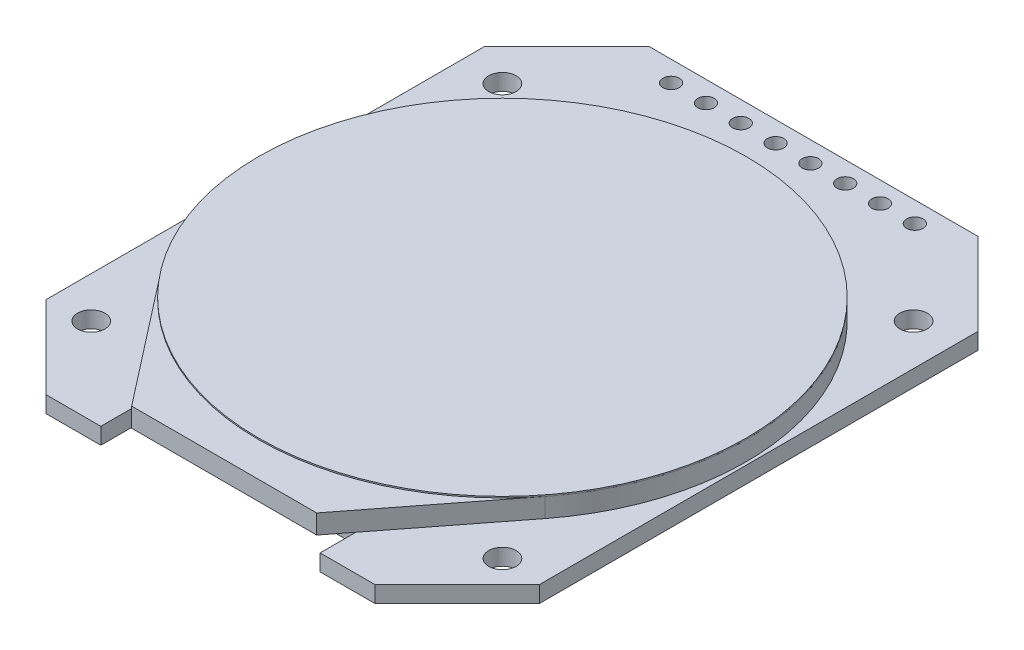
ISO-10303-21;
HEADER;
FILE_DESCRIPTION(('STEP AP214'),'2;1');
FILE_NAME('part.step','',(''),(''),'','','');
FILE_SCHEMA(('AUTOMOTIVE_DESIGN { 1 0 10303 214 1 1 1 1 }'));
ENDSEC;
DATA;
#1=APPLICATION_CONTEXT('core data for automotive mechanical design processes');
#2=APPLICATION_PROTOCOL_DEFINITION('international standard','automotive_design',2000,#1);
#3=PRODUCT_CONTEXT('',#1,'mechanical');
#4=PRODUCT('Part','Part','',(#3));
#5=PRODUCT_RELATED_PRODUCT_CATEGORY('part','',(#4));
#6=PRODUCT_DEFINITION_FORMATION('','',#4);
#7=PRODUCT_DEFINITION_CONTEXT('part definition',#1,'design');
#8=PRODUCT_DEFINITION('design','',#6,#7);
#9=PRODUCT_DEFINITION_SHAPE('','',#8);
#10=(LENGTH_UNIT() NAMED_UNIT(*) SI_UNIT(.MILLI.,.METRE.));
#11=(NAMED_UNIT(*) PLANE_ANGLE_UNIT() SI_UNIT($,.RADIAN.));
#12=(NAMED_UNIT(*) SI_UNIT($,.STERADIAN.) SOLID_ANGLE_UNIT());
#13=UNCERTAINTY_MEASURE_WITH_UNIT(LENGTH_MEASURE(1.E-05),#10,'distance_accuracy_value','');
#14=(GEOMETRIC_REPRESENTATION_CONTEXT(3) GLOBAL_UNCERTAINTY_ASSIGNED_CONTEXT((#13)) GLOBAL_UNIT_ASSIGNED_CONTEXT((#10,
#11,#12)) REPRESENTATION_CONTEXT('',''));
#15=CARTESIAN_POINT('',(0.,0.,0.));
#16=DIRECTION('',(0.,0.,1.));
#17=DIRECTION('',(1.,0.,0.));
#18=AXIS2_PLACEMENT_3D('',#15,#16,#17);
#19=CARTESIAN_POINT('',(0.,1.5,0.699999999999999));
#20=DIRECTION('',(0.,-1.,0.));
#21=DIRECTION('',(0.,0.,-1.));
#22=AXIS2_PLACEMENT_3D('',#19,#20,#21);
#23=CYLINDRICAL_SURFACE('',#22,17.79);
#24=CARTESIAN_POINT('',(0.,1.5,0.699999999999999));
#25=DIRECTION('',(0.,1.,0.));
#26=DIRECTION('',(0.,0.,1.));
#27=AXIS2_PLACEMENT_3D('',#24,#25,#26);
#28=CIRCLE('',#27,17.79);
#29=CARTESIAN_POINT('',(0.,1.5,18.49));
#30=VERTEX_POINT('',#29);
#31=EDGE_CURVE('E11',#30,#30,#28,.T.);
#32=ORIENTED_EDGE('',*,*,#31,.F.);
#33=EDGE_LOOP('',(#32));
#34=FACE_BOUND('',#33,.T.);
#35=CARTESIAN_POINT('',(0.,1.4,0.699999999999999));
#36=DIRECTION('',(0.,1.,0.));
#37=DIRECTION('',(0.,0.,1.));
#38=AXIS2_PLACEMENT_3D('',#35,#36,#37);
#39=CIRCLE('',#38,17.79);
#40=CARTESIAN_POINT('',(0.,1.4,18.49));
#41=VERTEX_POINT('',#40);
#42=EDGE_CURVE('E52',#41,#41,#39,.T.);
#43=ORIENTED_EDGE('',*,*,#42,.T.);
#44=EDGE_LOOP('',(#43));
#45=FACE_BOUND('',#44,.T.);
#46=ADVANCED_FACE('F49',(#34,#45),#23,.T.);
#47=CARTESIAN_POINT('',(0.,1.5,0.699999999999999));
#48=DIRECTION('',(0.,1.,0.));
#49=DIRECTION('',(0.,0.,1.));
#50=AXIS2_PLACEMENT_3D('',#47,#48,#49);
#51=PLANE('',#50);
#52=ORIENTED_EDGE('',*,*,#31,.T.);
#53=EDGE_LOOP('',(#52));
#54=FACE_BOUND('',#53,.T.);
#55=ADVANCED_FACE('F64',(#54),#51,.T.);
#56=CARTESIAN_POINT('',(0.,1.4,0.699999999999999));
#57=DIRECTION('',(0.,1.,0.));
#58=DIRECTION('',(0.,0.,1.));
#59=AXIS2_PLACEMENT_3D('',#56,#57,#58);
#60=PLANE('',#59);
#61=ORIENTED_EDGE('',*,*,#42,.F.);
#62=EDGE_LOOP('',(#61));
#63=FACE_BOUND('',#62,.T.);
#64=ADVANCED_FACE('F62',(#63),#60,.F.);
#65=CLOSED_SHELL('',(#46,#55,#64));
#66=MANIFOLD_SOLID_BREP('B2',#65);
#67=CARTESIAN_POINT('',(14.3828217753482,1.4,11.1844594671487));
#68=DIRECTION('',(-0.789410190203827,0.,-0.613866069759811));
#69=DIRECTION('',(-0.613866069759811,0.,0.789410190203827));
#70=AXIS2_PLACEMENT_3D('',#67,#68,#69);
#71=PLANE('',#70);
#72=DIRECTION('',(0.613866069759811,0.,-0.789410190203827));
#73=VECTOR('',#72,1.);
#74=CARTESIAN_POINT('',(14.3828217753482,0.,11.1844594671487));
#75=LINE('',#74,#73);
#76=CARTESIAN_POINT('',(6.75,0.,21.));
#77=VERTEX_POINT('',#76);
#78=CARTESIAN_POINT('',(14.0436072837261,0.,11.620677381027));
#79=VERTEX_POINT('',#78);
#80=EDGE_CURVE('E161',#77,#79,#75,.T.);
#81=ORIENTED_EDGE('',*,*,#80,.T.);
#82=DIRECTION('',(0.,-1.,0.));
#83=VECTOR('',#82,1.);
#84=CARTESIAN_POINT('',(14.0436072837261,1.4,11.620677381027));
#85=LINE('',#84,#83);
#86=CARTESIAN_POINT('',(14.0436072837261,1.4,11.620677381027));
#87=VERTEX_POINT('',#86);
#88=EDGE_CURVE('E47',#87,#79,#85,.T.);
#89=ORIENTED_EDGE('',*,*,#88,.F.);
#90=DIRECTION('',(0.613866069759811,0.,-0.789410190203827));
#91=VECTOR('',#90,1.);
#92=CARTESIAN_POINT('',(14.3828217753482,1.4,11.1844594671487));
#93=LINE('',#92,#91);
#94=CARTESIAN_POINT('',(6.75,1.4,21.));
#95=VERTEX_POINT('',#94);
#96=EDGE_CURVE('E149',#95,#87,#93,.T.);
#97=ORIENTED_EDGE('',*,*,#96,.F.);
#98=DIRECTION('',(0.,-1.,0.));
#99=VECTOR('',#98,1.);
#100=CARTESIAN_POINT('',(6.75,1.4,21.));
#101=LINE('',#100,#99);
#102=EDGE_CURVE('E157',#95,#77,#101,.T.);
#103=ORIENTED_EDGE('',*,*,#102,.T.);
#104=EDGE_LOOP('',(#81,#89,#97,#103));
#105=FACE_BOUND('',#104,.T.);
#106=ADVANCED_FACE('F98',(#105),#71,.F.);
#107=CARTESIAN_POINT('',(0.,1.4,0.699999999999999));
#108=DIRECTION('',(0.,-1.,0.));
#109=DIRECTION('',(0.,0.,-1.));
#110=AXIS2_PLACEMENT_3D('',#107,#108,#109);
#111=CYLINDRICAL_SURFACE('',#110,17.79);
#112=CARTESIAN_POINT('',(0.,0.,0.699999999999999));
#113=DIRECTION('',(0.,1.,0.));
#114=DIRECTION('',(0.,0.,1.));
#115=AXIS2_PLACEMENT_3D('',#112,#113,#114);
#116=CIRCLE('',#115,17.79);
#117=CARTESIAN_POINT('',(-14.0436072837261,0.,11.620677381027));
#118=VERTEX_POINT('',#117);
#119=EDGE_CURVE('E153',#79,#118,#116,.T.);
#120=ORIENTED_EDGE('',*,*,#119,.T.);
#121=DIRECTION('',(0.,-1.,0.));
#122=VECTOR('',#121,1.);
#123=CARTESIAN_POINT('',(-14.0436072837261,1.4,11.620677381027));
#124=LINE('',#123,#122);
#125=CARTESIAN_POINT('',(-14.0436072837261,1.4,11.620677381027));
#126=VERTEX_POINT('',#125);
#127=EDGE_CURVE('E106',#126,#118,#124,.T.);
#128=ORIENTED_EDGE('',*,*,#127,.F.);
#129=CARTESIAN_POINT('',(0.,1.4,0.699999999999999));
#130=DIRECTION('',(0.,1.,0.));
#131=DIRECTION('',(0.,0.,1.));
#132=AXIS2_PLACEMENT_3D('',#129,#130,#131);
#133=CIRCLE('',#132,17.79);
#134=EDGE_CURVE('E144',#87,#126,#133,.T.);
#135=ORIENTED_EDGE('',*,*,#134,.F.);
#136=ORIENTED_EDGE('',*,*,#88,.T.);
#137=EDGE_LOOP('',(#120,#128,#135,#136));
#138=FACE_BOUND('',#137,.T.);
#139=ADVANCED_FACE('F152',(#138),#111,.T.);
#140=CARTESIAN_POINT('',(-14.3828217753482,1.4,11.1844594671487));
#141=DIRECTION('',(0.789410190203827,0.,-0.613866069759811));
#142=DIRECTION('',(-0.613866069759811,0.,-0.789410190203827));
#143=AXIS2_PLACEMENT_3D('',#140,#141,#142);
#144=PLANE('',#143);
#145=DIRECTION('',(0.613866069759811,0.,0.789410190203827));
#146=VECTOR('',#145,1.);
#147=CARTESIAN_POINT('',(-14.3828217753482,0.,11.1844594671487));
#148=LINE('',#147,#146);
#149=CARTESIAN_POINT('',(-6.75,0.,21.));
#150=VERTEX_POINT('',#149);
#151=EDGE_CURVE('E131',#118,#150,#148,.T.);
#152=ORIENTED_EDGE('',*,*,#151,.T.);
#153=DIRECTION('',(0.,-1.,0.));
#154=VECTOR('',#153,1.);
#155=CARTESIAN_POINT('',(-6.75,1.4,21.));
#156=LINE('',#155,#154);
#157=CARTESIAN_POINT('',(-6.75,1.4,21.));
#158=VERTEX_POINT('',#157);
#159=EDGE_CURVE('E154',#158,#150,#156,.T.);
#160=ORIENTED_EDGE('',*,*,#159,.F.);
#161=DIRECTION('',(0.613866069759811,0.,0.789410190203827));
#162=VECTOR('',#161,1.);
#163=CARTESIAN_POINT('',(-14.3828217753482,1.4,11.1844594671487));
#164=LINE('',#163,#162);
#165=EDGE_CURVE('E147',#126,#158,#164,.T.);
#166=ORIENTED_EDGE('',*,*,#165,.F.);
#167=ORIENTED_EDGE('',*,*,#127,.T.);
#168=EDGE_LOOP('',(#152,#160,#166,#167));
#169=FACE_BOUND('',#168,.T.);
#170=ADVANCED_FACE('F155',(#169),#144,.F.);
#171=CARTESIAN_POINT('',(0.,1.4,21.));
#172=DIRECTION('',(0.,0.,-1.));
#173=DIRECTION('',(-1.,0.,0.));
#174=AXIS2_PLACEMENT_3D('',#171,#172,#173);
#175=PLANE('',#174);
#176=DIRECTION('',(1.,0.,0.));
#177=VECTOR('',#176,1.);
#178=CARTESIAN_POINT('',(0.,0.,21.));
#179=LINE('',#178,#177);
#180=EDGE_CURVE('E137',#150,#77,#179,.T.);
#181=ORIENTED_EDGE('',*,*,#180,.T.);
#182=ORIENTED_EDGE('',*,*,#102,.F.);
#183=DIRECTION('',(1.,0.,0.));
#184=VECTOR('',#183,1.);
#185=CARTESIAN_POINT('',(0.,1.4,21.));
#186=LINE('',#185,#184);
#187=EDGE_CURVE('E114',#158,#95,#186,.T.);
#188=ORIENTED_EDGE('',*,*,#187,.F.);
#189=ORIENTED_EDGE('',*,*,#159,.T.);
#190=EDGE_LOOP('',(#181,#182,#188,#189));
#191=FACE_BOUND('',#190,.T.);
#192=ADVANCED_FACE('F168',(#191),#175,.F.);
#193=CARTESIAN_POINT('',(0.,1.4,0.));
#194=DIRECTION('',(0.,1.,0.));
#195=DIRECTION('',(0.,0.,1.));
#196=AXIS2_PLACEMENT_3D('',#193,#194,#195);
#197=PLANE('',#196);
#198=ORIENTED_EDGE('',*,*,#96,.T.);
#199=ORIENTED_EDGE('',*,*,#134,.T.);
#200=ORIENTED_EDGE('',*,*,#165,.T.);
#201=ORIENTED_EDGE('',*,*,#187,.T.);
#202=EDGE_LOOP('',(#198,#199,#200,#201));
#203=FACE_BOUND('',#202,.T.);
#204=ADVANCED_FACE('F145',(#203),#197,.T.);
#205=CARTESIAN_POINT('',(0.,0.,0.));
#206=DIRECTION('',(0.,1.,0.));
#207=DIRECTION('',(0.,0.,1.));
#208=AXIS2_PLACEMENT_3D('',#205,#206,#207);
#209=PLANE('',#208);
#210=ORIENTED_EDGE('',*,*,#80,.F.);
#211=ORIENTED_EDGE('',*,*,#180,.F.);
#212=ORIENTED_EDGE('',*,*,#151,.F.);
#213=ORIENTED_EDGE('',*,*,#119,.F.);
#214=EDGE_LOOP('',(#210,#211,#212,#213));
#215=FACE_BOUND('',#214,.T.);
#216=ADVANCED_FACE('F171',(#215),#209,.F.);
#217=CLOSED_SHELL('',(#106,#139,#170,#192,#204,#216));
#218=MANIFOLD_SOLID_BREP('B6',#217);
#219=CARTESIAN_POINT('',(0.,-1.2,19.));
#220=DIRECTION('',(0.,0.,1.));
#221=DIRECTION('',(1.,0.,0.));
#222=AXIS2_PLACEMENT_3D('',#219,#220,#221);
#223=PLANE('',#222);
#224=DIRECTION('',(1.,0.,0.));
#225=VECTOR('',#224,1.);
#226=CARTESIAN_POINT('',(0.,0.,19.));
#227=LINE('',#226,#225);
#228=CARTESIAN_POINT('',(-8.,0.,19.));
#229=VERTEX_POINT('',#228);
#230=CARTESIAN_POINT('',(8.,0.,19.));
#231=VERTEX_POINT('',#230);
#232=EDGE_CURVE('E392',#229,#231,#227,.T.);
#233=ORIENTED_EDGE('',*,*,#232,.F.);
#234=DIRECTION('',(0.,1.,0.));
#235=VECTOR('',#234,1.);
#236=CARTESIAN_POINT('',(-8.,-1.2,19.));
#237=LINE('',#236,#235);
#238=CARTESIAN_POINT('',(-8.,-1.2,19.));
#239=VERTEX_POINT('',#238);
#240=EDGE_CURVE('E96',#239,#229,#237,.T.);
#241=ORIENTED_EDGE('',*,*,#240,.F.);
#242=DIRECTION('',(1.,0.,0.));
#243=VECTOR('',#242,1.);
#244=CARTESIAN_POINT('',(0.,-1.2,19.));
#245=LINE('',#244,#243);
#246=CARTESIAN_POINT('',(8.,-1.2,19.));
#247=VERTEX_POINT('',#246);
#248=EDGE_CURVE('E458',#239,#247,#245,.T.);
#249=ORIENTED_EDGE('',*,*,#248,.T.);
#250=DIRECTION('',(0.,1.,0.));
#251=VECTOR('',#250,1.);
#252=CARTESIAN_POINT('',(8.,-1.2,19.));
#253=LINE('',#252,#251);
#254=EDGE_CURVE('E237',#247,#231,#253,.T.);
#255=ORIENTED_EDGE('',*,*,#254,.T.);
#256=EDGE_LOOP('',(#233,#241,#249,#255));
#257=FACE_BOUND('',#256,.T.);
#258=ADVANCED_FACE('F233',(#257),#223,.T.);
#259=CARTESIAN_POINT('',(-8.,-1.2,0.));
#260=DIRECTION('',(1.,0.,0.));
#261=DIRECTION('',(0.,0.,-1.));
#262=AXIS2_PLACEMENT_3D('',#259,#260,#261);
#263=PLANE('',#262);
#264=DIRECTION('',(0.,0.,-1.));
#265=VECTOR('',#264,1.);
#266=CARTESIAN_POINT('',(-8.,0.,0.));
#267=LINE('',#266,#265);
#268=CARTESIAN_POINT('',(-8.,0.,22.));
#269=VERTEX_POINT('',#268);
#270=EDGE_CURVE('E421',#269,#229,#267,.T.);
#271=ORIENTED_EDGE('',*,*,#270,.F.);
#272=DIRECTION('',(0.,1.,0.));
#273=VECTOR('',#272,1.);
#274=CARTESIAN_POINT('',(-8.,-1.2,22.));
#275=LINE('',#274,#273);
#276=CARTESIAN_POINT('',(-8.,-1.2,22.));
#277=VERTEX_POINT('',#276);
#278=EDGE_CURVE('E243',#277,#269,#275,.T.);
#279=ORIENTED_EDGE('',*,*,#278,.F.);
#280=DIRECTION('',(0.,0.,-1.));
#281=VECTOR('',#280,1.);
#282=CARTESIAN_POINT('',(-8.,-1.2,0.));
#283=LINE('',#282,#281);
#284=EDGE_CURVE('E344',#277,#239,#283,.T.);
#285=ORIENTED_EDGE('',*,*,#284,.T.);
#286=ORIENTED_EDGE('',*,*,#240,.T.);
#287=EDGE_LOOP('',(#271,#279,#285,#286));
#288=FACE_BOUND('',#287,.T.);
#289=ADVANCED_FACE('F463',(#288),#263,.T.);
#290=CARTESIAN_POINT('',(0.,-1.2,22.));
#291=DIRECTION('',(0.,0.,1.));
#292=DIRECTION('',(1.,0.,0.));
#293=AXIS2_PLACEMENT_3D('',#290,#291,#292);
#294=PLANE('',#293);
#295=DIRECTION('',(1.,0.,0.));
#296=VECTOR('',#295,1.);
#297=CARTESIAN_POINT('',(0.,0.,22.));
#298=LINE('',#297,#296);
#299=CARTESIAN_POINT('',(-12.,0.,22.));
#300=VERTEX_POINT('',#299);
#301=EDGE_CURVE('E332',#300,#269,#298,.T.);
#302=ORIENTED_EDGE('',*,*,#301,.F.);
#303=DIRECTION('',(0.,1.,0.));
#304=VECTOR('',#303,1.);
#305=CARTESIAN_POINT('',(-12.,-1.2,22.));
#306=LINE('',#305,#304);
#307=CARTESIAN_POINT('',(-12.,-1.2,22.));
#308=VERTEX_POINT('',#307);
#309=EDGE_CURVE('E327',#308,#300,#306,.T.);
#310=ORIENTED_EDGE('',*,*,#309,.F.);
#311=DIRECTION('',(1.,0.,0.));
#312=VECTOR('',#311,1.);
#313=CARTESIAN_POINT('',(0.,-1.2,22.));
#314=LINE('',#313,#312);
#315=EDGE_CURVE('E330',#308,#277,#314,.T.);
#316=ORIENTED_EDGE('',*,*,#315,.T.);
#317=ORIENTED_EDGE('',*,*,#278,.T.);
#318=EDGE_LOOP('',(#302,#310,#316,#317));
#319=FACE_BOUND('',#318,.T.);
#320=ADVANCED_FACE('F329',(#319),#294,.T.);
#321=CARTESIAN_POINT('',(-17.,-1.2,17.));
#322=DIRECTION('',(-0.707106781186547,0.,0.707106781186548));
#323=DIRECTION('',(0.707106781186548,0.,0.707106781186547));
#324=AXIS2_PLACEMENT_3D('',#321,#322,#323);
#325=PLANE('',#324);
#326=DIRECTION('',(0.707106781186548,0.,0.707106781186547));
#327=VECTOR('',#326,1.);
#328=CARTESIAN_POINT('',(-17.,0.,17.));
#329=LINE('',#328,#327);
#330=CARTESIAN_POINT('',(-18.,0.,16.));
#331=VERTEX_POINT('',#330);
#332=EDGE_CURVE('E419',#331,#300,#329,.T.);
#333=ORIENTED_EDGE('',*,*,#332,.F.);
#334=DIRECTION('',(0.,1.,0.));
#335=VECTOR('',#334,1.);
#336=CARTESIAN_POINT('',(-18.,-1.2,16.));
#337=LINE('',#336,#335);
#338=CARTESIAN_POINT('',(-18.,-1.2,16.));
#339=VERTEX_POINT('',#338);
#340=EDGE_CURVE('E337',#339,#331,#337,.T.);
#341=ORIENTED_EDGE('',*,*,#340,.F.);
#342=DIRECTION('',(0.707106781186548,0.,0.707106781186547));
#343=VECTOR('',#342,1.);
#344=CARTESIAN_POINT('',(-17.,-1.2,17.));
#345=LINE('',#344,#343);
#346=EDGE_CURVE('E343',#339,#308,#345,.T.);
#347=ORIENTED_EDGE('',*,*,#346,.T.);
#348=ORIENTED_EDGE('',*,*,#309,.T.);
#349=EDGE_LOOP('',(#333,#341,#347,#348));
#350=FACE_BOUND('',#349,.T.);
#351=ADVANCED_FACE('F347',(#350),#325,.T.);
#352=CARTESIAN_POINT('',(-18.,-1.2,0.));
#353=DIRECTION('',(1.,0.,0.));
#354=DIRECTION('',(0.,0.,-1.));
#355=AXIS2_PLACEMENT_3D('',#352,#353,#354);
#356=PLANE('',#355);
#357=DIRECTION('',(0.,0.,-1.));
#358=VECTOR('',#357,1.);
#359=CARTESIAN_POINT('',(-18.,0.,0.));
#360=LINE('',#359,#358);
#361=CARTESIAN_POINT('',(-18.,0.,-16.));
#362=VERTEX_POINT('',#361);
#363=EDGE_CURVE('E416',#331,#362,#360,.T.);
#364=ORIENTED_EDGE('',*,*,#363,.T.);
#365=DIRECTION('',(0.,1.,0.));
#366=VECTOR('',#365,1.);
#367=CARTESIAN_POINT('',(-18.,-1.2,-16.));
#368=LINE('',#367,#366);
#369=CARTESIAN_POINT('',(-18.,-1.2,-16.));
#370=VERTEX_POINT('',#369);
#371=EDGE_CURVE('E445',#370,#362,#368,.T.);
#372=ORIENTED_EDGE('',*,*,#371,.F.);
#373=DIRECTION('',(0.,0.,-1.));
#374=VECTOR('',#373,1.);
#375=CARTESIAN_POINT('',(-18.,-1.2,0.));
#376=LINE('',#375,#374);
#377=EDGE_CURVE('E349',#339,#370,#376,.T.);
#378=ORIENTED_EDGE('',*,*,#377,.F.);
#379=ORIENTED_EDGE('',*,*,#340,.T.);
#380=EDGE_LOOP('',(#364,#372,#378,#379));
#381=FACE_BOUND('',#380,.T.);
#382=ADVANCED_FACE('F479',(#381),#356,.F.);
#383=CARTESIAN_POINT('',(-17.,-1.2,-17.));
#384=DIRECTION('',(-0.707106781186547,0.,-0.707106781186548));
#385=DIRECTION('',(-0.707106781186548,0.,0.707106781186547));
#386=AXIS2_PLACEMENT_3D('',#383,#384,#385);
#387=PLANE('',#386);
#388=DIRECTION('',(-0.707106781186548,0.,0.707106781186547));
#389=VECTOR('',#388,1.);
#390=CARTESIAN_POINT('',(-17.,0.,-17.));
#391=LINE('',#390,#389);
#392=CARTESIAN_POINT('',(-12.,0.,-22.));
#393=VERTEX_POINT('',#392);
#394=EDGE_CURVE('E413',#393,#362,#391,.T.);
#395=ORIENTED_EDGE('',*,*,#394,.F.);
#396=DIRECTION('',(0.,1.,0.));
#397=VECTOR('',#396,1.);
#398=CARTESIAN_POINT('',(-12.,-1.2,-22.));
#399=LINE('',#398,#397);
#400=CARTESIAN_POINT('',(-12.,-1.2,-22.));
#401=VERTEX_POINT('',#400);
#402=EDGE_CURVE('E447',#401,#393,#399,.T.);
#403=ORIENTED_EDGE('',*,*,#402,.F.);
#404=DIRECTION('',(-0.707106781186548,0.,0.707106781186547));
#405=VECTOR('',#404,1.);
#406=CARTESIAN_POINT('',(-17.,-1.2,-17.));
#407=LINE('',#406,#405);
#408=EDGE_CURVE('E351',#401,#370,#407,.T.);
#409=ORIENTED_EDGE('',*,*,#408,.T.);
#410=ORIENTED_EDGE('',*,*,#371,.T.);
#411=EDGE_LOOP('',(#395,#403,#409,#410));
#412=FACE_BOUND('',#411,.T.);
#413=ADVANCED_FACE('F482',(#412),#387,.T.);
#414=CARTESIAN_POINT('',(0.,-1.2,-22.));
#415=DIRECTION('',(0.,0.,1.));
#416=DIRECTION('',(1.,0.,0.));
#417=AXIS2_PLACEMENT_3D('',#414,#415,#416);
#418=PLANE('',#417);
#419=DIRECTION('',(1.,0.,0.));
#420=VECTOR('',#419,1.);
#421=CARTESIAN_POINT('',(0.,0.,-22.));
#422=LINE('',#421,#420);
#423=CARTESIAN_POINT('',(12.,0.,-22.));
#424=VERTEX_POINT('',#423);
#425=EDGE_CURVE('E410',#393,#424,#422,.T.);
#426=ORIENTED_EDGE('',*,*,#425,.T.);
#427=DIRECTION('',(0.,1.,0.));
#428=VECTOR('',#427,1.);
#429=CARTESIAN_POINT('',(12.,-1.2,-22.));
#430=LINE('',#429,#428);
#431=CARTESIAN_POINT('',(12.,-1.2,-22.));
#432=VERTEX_POINT('',#431);
#433=EDGE_CURVE('E449',#432,#424,#430,.T.);
#434=ORIENTED_EDGE('',*,*,#433,.F.);
#435=DIRECTION('',(1.,0.,0.));
#436=VECTOR('',#435,1.);
#437=CARTESIAN_POINT('',(0.,-1.2,-22.));
#438=LINE('',#437,#436);
#439=EDGE_CURVE('E781',#401,#432,#438,.T.);
#440=ORIENTED_EDGE('',*,*,#439,.F.);
#441=ORIENTED_EDGE('',*,*,#402,.T.);
#442=EDGE_LOOP('',(#426,#434,#440,#441));
#443=FACE_BOUND('',#442,.T.);
#444=ADVANCED_FACE('F486',(#443),#418,.F.);
#445=CARTESIAN_POINT('',(17.,-1.2,-17.));
#446=DIRECTION('',(0.707106781186547,0.,-0.707106781186548));
#447=DIRECTION('',(-0.707106781186548,0.,-0.707106781186547));
#448=AXIS2_PLACEMENT_3D('',#445,#446,#447);
#449=PLANE('',#448);
#450=DIRECTION('',(-0.707106781186548,0.,-0.707106781186547));
#451=VECTOR('',#450,1.);
#452=CARTESIAN_POINT('',(17.,0.,-17.));
#453=LINE('',#452,#451);
#454=CARTESIAN_POINT('',(18.,0.,-16.));
#455=VERTEX_POINT('',#454);
#456=EDGE_CURVE('E407',#455,#424,#453,.T.);
#457=ORIENTED_EDGE('',*,*,#456,.F.);
#458=DIRECTION('',(0.,1.,0.));
#459=VECTOR('',#458,1.);
#460=CARTESIAN_POINT('',(18.,-1.2,-16.));
#461=LINE('',#460,#459);
#462=CARTESIAN_POINT('',(18.,-1.2,-16.));
#463=VERTEX_POINT('',#462);
#464=EDGE_CURVE('E451',#463,#455,#461,.T.);
#465=ORIENTED_EDGE('',*,*,#464,.F.);
#466=DIRECTION('',(-0.707106781186548,0.,-0.707106781186547));
#467=VECTOR('',#466,1.);
#468=CARTESIAN_POINT('',(17.,-1.2,-17.));
#469=LINE('',#468,#467);
#470=EDGE_CURVE('E782',#463,#432,#469,.T.);
#471=ORIENTED_EDGE('',*,*,#470,.T.);
#472=ORIENTED_EDGE('',*,*,#433,.T.);
#473=EDGE_LOOP('',(#457,#465,#471,#472));
#474=FACE_BOUND('',#473,.T.);
#475=ADVANCED_FACE('F490',(#474),#449,.T.);
#476=CARTESIAN_POINT('',(18.,-1.2,0.));
#477=DIRECTION('',(1.,0.,0.));
#478=DIRECTION('',(0.,0.,-1.));
#479=AXIS2_PLACEMENT_3D('',#476,#477,#478);
#480=PLANE('',#479);
#481=DIRECTION('',(0.,0.,-1.));
#482=VECTOR('',#481,1.);
#483=CARTESIAN_POINT('',(18.,0.,0.));
#484=LINE('',#483,#482);
#485=CARTESIAN_POINT('',(18.,0.,16.));
#486=VERTEX_POINT('',#485);
#487=EDGE_CURVE('E404',#486,#455,#484,.T.);
#488=ORIENTED_EDGE('',*,*,#487,.F.);
#489=DIRECTION('',(0.,1.,0.));
#490=VECTOR('',#489,1.);
#491=CARTESIAN_POINT('',(18.,-1.2,16.));
#492=LINE('',#491,#490);
#493=CARTESIAN_POINT('',(18.,-1.2,16.));
#494=VERTEX_POINT('',#493);
#495=EDGE_CURVE('E453',#494,#486,#492,.T.);
#496=ORIENTED_EDGE('',*,*,#495,.F.);
#497=DIRECTION('',(0.,0.,-1.));
#498=VECTOR('',#497,1.);
#499=CARTESIAN_POINT('',(18.,-1.2,0.));
#500=LINE('',#499,#498);
#501=EDGE_CURVE('E770',#494,#463,#500,.T.);
#502=ORIENTED_EDGE('',*,*,#501,.T.);
#503=ORIENTED_EDGE('',*,*,#464,.T.);
#504=EDGE_LOOP('',(#488,#496,#502,#503));
#505=FACE_BOUND('',#504,.T.);
#506=ADVANCED_FACE('F494',(#505),#480,.T.);
#507=CARTESIAN_POINT('',(17.,-1.2,17.));
#508=DIRECTION('',(0.707106781186547,0.,0.707106781186548));
#509=DIRECTION('',(0.707106781186548,0.,-0.707106781186547));
#510=AXIS2_PLACEMENT_3D('',#507,#508,#509);
#511=PLANE('',#510);
#512=DIRECTION('',(0.707106781186548,0.,-0.707106781186547));
#513=VECTOR('',#512,1.);
#514=CARTESIAN_POINT('',(17.,0.,17.));
#515=LINE('',#514,#513);
#516=CARTESIAN_POINT('',(12.,0.,22.));
#517=VERTEX_POINT('',#516);
#518=EDGE_CURVE('E401',#517,#486,#515,.T.);
#519=ORIENTED_EDGE('',*,*,#518,.F.);
#520=DIRECTION('',(0.,1.,0.));
#521=VECTOR('',#520,1.);
#522=CARTESIAN_POINT('',(12.,-1.2,22.));
#523=LINE('',#522,#521);
#524=CARTESIAN_POINT('',(12.,-1.2,22.));
#525=VERTEX_POINT('',#524);
#526=EDGE_CURVE('E455',#525,#517,#523,.T.);
#527=ORIENTED_EDGE('',*,*,#526,.F.);
#528=DIRECTION('',(0.707106781186548,0.,-0.707106781186547));
#529=VECTOR('',#528,1.);
#530=CARTESIAN_POINT('',(17.,-1.2,17.));
#531=LINE('',#530,#529);
#532=EDGE_CURVE('E766',#525,#494,#531,.T.);
#533=ORIENTED_EDGE('',*,*,#532,.T.);
#534=ORIENTED_EDGE('',*,*,#495,.T.);
#535=EDGE_LOOP('',(#519,#527,#533,#534));
#536=FACE_BOUND('',#535,.T.);
#537=ADVANCED_FACE('F498',(#536),#511,.T.);
#538=CARTESIAN_POINT('',(8.,0.,22.));
#539=VERTEX_POINT('',#538);
#540=EDGE_CURVE('E398',#539,#517,#298,.T.);
#541=ORIENTED_EDGE('',*,*,#540,.F.);
#542=DIRECTION('',(0.,1.,0.));
#543=VECTOR('',#542,1.);
#544=CARTESIAN_POINT('',(8.,-1.2,22.));
#545=LINE('',#544,#543);
#546=CARTESIAN_POINT('',(8.,-1.2,22.));
#547=VERTEX_POINT('',#546);
#548=EDGE_CURVE('E456',#547,#539,#545,.T.);
#549=ORIENTED_EDGE('',*,*,#548,.F.);
#550=EDGE_CURVE('E346',#547,#525,#314,.T.);
#551=ORIENTED_EDGE('',*,*,#550,.T.);
#552=ORIENTED_EDGE('',*,*,#526,.T.);
#553=EDGE_LOOP('',(#541,#549,#551,#552));
#554=FACE_BOUND('',#553,.T.);
#555=ADVANCED_FACE('F471',(#554),#294,.T.);
#556=CARTESIAN_POINT('',(3.80999999999997,-1.2,-20.5));
#557=DIRECTION('',(0.,1.,0.));
#558=DIRECTION('',(0.,0.,1.));
#559=AXIS2_PLACEMENT_3D('',#556,#557,#558);
#560=CYLINDRICAL_SURFACE('',#559,0.6);
#561=CARTESIAN_POINT('',(3.80999999999997,-1.2,-20.5));
#562=DIRECTION('',(0.,1.,0.));
#563=DIRECTION('',(0.,0.,1.));
#564=AXIS2_PLACEMENT_3D('',#561,#562,#563);
#565=CIRCLE('',#564,0.6);
#566=CARTESIAN_POINT('',(3.80999999999997,-1.2,-19.9));
#567=VERTEX_POINT('',#566);
#568=EDGE_CURVE('E368',#567,#567,#565,.F.);
#569=ORIENTED_EDGE('',*,*,#568,.T.);
#570=EDGE_LOOP('',(#569));
#571=FACE_BOUND('',#570,.T.);
#572=CARTESIAN_POINT('',(3.80999999999997,0.,-20.5));
#573=DIRECTION('',(0.,1.,0.));
#574=DIRECTION('',(0.,0.,1.));
#575=AXIS2_PLACEMENT_3D('',#572,#573,#574);
#576=CIRCLE('',#575,0.6);
#577=CARTESIAN_POINT('',(3.80999999999997,0.,-19.9));
#578=VERTEX_POINT('',#577);
#579=EDGE_CURVE('E436',#578,#578,#576,.F.);
#580=ORIENTED_EDGE('',*,*,#579,.F.);
#581=EDGE_LOOP('',(#580));
#582=FACE_BOUND('',#581,.T.);
#583=ADVANCED_FACE('F558',(#571,#582),#560,.F.);
#584=CARTESIAN_POINT('',(15.,-1.2,15.7));
#585=DIRECTION('',(0.,1.,0.));
#586=DIRECTION('',(0.,0.,1.));
#587=AXIS2_PLACEMENT_3D('',#584,#585,#586);
#588=CYLINDRICAL_SURFACE('',#587,1.);
#589=CARTESIAN_POINT('',(15.,-1.2,15.7));
#590=DIRECTION('',(0.,1.,0.));
#591=DIRECTION('',(0.,0.,1.));
#592=AXIS2_PLACEMENT_3D('',#589,#590,#591);
#593=CIRCLE('',#592,1.);
#594=CARTESIAN_POINT('',(15.,-1.2,16.7));
#595=VERTEX_POINT('',#594);
#596=EDGE_CURVE('E365',#595,#595,#593,.T.);
#597=ORIENTED_EDGE('',*,*,#596,.F.);
#598=EDGE_LOOP('',(#597));
#599=FACE_BOUND('',#598,.T.);
#600=CARTESIAN_POINT('',(15.,0.,15.7));
#601=DIRECTION('',(0.,1.,0.));
#602=DIRECTION('',(0.,0.,1.));
#603=AXIS2_PLACEMENT_3D('',#600,#601,#602);
#604=CIRCLE('',#603,1.);
#605=CARTESIAN_POINT('',(15.,0.,16.7));
#606=VERTEX_POINT('',#605);
#607=EDGE_CURVE('E433',#606,#606,#604,.T.);
#608=ORIENTED_EDGE('',*,*,#607,.T.);
#609=EDGE_LOOP('',(#608));
#610=FACE_BOUND('',#609,.T.);
#611=ADVANCED_FACE('F561',(#599,#610),#588,.F.);
#612=CARTESIAN_POINT('',(-15.,-1.2,15.7));
#613=DIRECTION('',(0.,1.,0.));
#614=DIRECTION('',(0.,0.,1.));
#615=AXIS2_PLACEMENT_3D('',#612,#613,#614);
#616=CYLINDRICAL_SURFACE('',#615,1.);
#617=CARTESIAN_POINT('',(-15.,-1.2,15.7));
#618=DIRECTION('',(0.,1.,0.));
#619=DIRECTION('',(0.,0.,1.));
#620=AXIS2_PLACEMENT_3D('',#617,#618,#619);
#621=CIRCLE('',#620,1.);
#622=CARTESIAN_POINT('',(-15.,-1.2,16.7));
#623=VERTEX_POINT('',#622);
#624=EDGE_CURVE('E362',#623,#623,#621,.T.);
#625=ORIENTED_EDGE('',*,*,#624,.F.);
#626=EDGE_LOOP('',(#625));
#627=FACE_BOUND('',#626,.T.);
#628=CARTESIAN_POINT('',(-15.,0.,15.7));
#629=DIRECTION('',(0.,1.,0.));
#630=DIRECTION('',(0.,0.,1.));
#631=AXIS2_PLACEMENT_3D('',#628,#629,#630);
#632=CIRCLE('',#631,1.);
#633=CARTESIAN_POINT('',(-15.,0.,16.7));
#634=VERTEX_POINT('',#633);
#635=EDGE_CURVE('E430',#634,#634,#632,.T.);
#636=ORIENTED_EDGE('',*,*,#635,.T.);
#637=EDGE_LOOP('',(#636));
#638=FACE_BOUND('',#637,.T.);
#639=ADVANCED_FACE('F565',(#627,#638),#616,.F.);
#640=CARTESIAN_POINT('',(-15.,-1.2,-14.3));
#641=DIRECTION('',(0.,1.,0.));
#642=DIRECTION('',(0.,0.,1.));
#643=AXIS2_PLACEMENT_3D('',#640,#641,#642);
#644=CYLINDRICAL_SURFACE('',#643,1.);
#645=CARTESIAN_POINT('',(-15.,-1.2,-14.3));
#646=DIRECTION('',(0.,1.,0.));
#647=DIRECTION('',(0.,0.,1.));
#648=AXIS2_PLACEMENT_3D('',#645,#646,#647);
#649=CIRCLE('',#648,1.);
#650=CARTESIAN_POINT('',(-15.,-1.2,-13.3));
#651=VERTEX_POINT('',#650);
#652=EDGE_CURVE('E359',#651,#651,#649,.T.);
#653=ORIENTED_EDGE('',*,*,#652,.F.);
#654=EDGE_LOOP('',(#653));
#655=FACE_BOUND('',#654,.T.);
#656=CARTESIAN_POINT('',(-15.,0.,-14.3));
#657=DIRECTION('',(0.,1.,0.));
#658=DIRECTION('',(0.,0.,1.));
#659=AXIS2_PLACEMENT_3D('',#656,#657,#658);
#660=CIRCLE('',#659,1.);
#661=CARTESIAN_POINT('',(-15.,0.,-13.3));
#662=VERTEX_POINT('',#661);
#663=EDGE_CURVE('E427',#662,#662,#660,.T.);
#664=ORIENTED_EDGE('',*,*,#663,.T.);
#665=EDGE_LOOP('',(#664));
#666=FACE_BOUND('',#665,.T.);
#667=ADVANCED_FACE('F568',(#655,#666),#644,.F.);
#668=CARTESIAN_POINT('',(15.,-1.2,-14.3));
#669=DIRECTION('',(0.,1.,0.));
#670=DIRECTION('',(0.,0.,1.));
#671=AXIS2_PLACEMENT_3D('',#668,#669,#670);
#672=CYLINDRICAL_SURFACE('',#671,1.);
#673=CARTESIAN_POINT('',(15.,-1.2,-14.3));
#674=DIRECTION('',(0.,1.,0.));
#675=DIRECTION('',(0.,0.,1.));
#676=AXIS2_PLACEMENT_3D('',#673,#674,#675);
#677=CIRCLE('',#676,1.);
#678=CARTESIAN_POINT('',(15.,-1.2,-13.3));
#679=VERTEX_POINT('',#678);
#680=EDGE_CURVE('E356',#679,#679,#677,.T.);
#681=ORIENTED_EDGE('',*,*,#680,.F.);
#682=EDGE_LOOP('',(#681));
#683=FACE_BOUND('',#682,.T.);
#684=CARTESIAN_POINT('',(15.,0.,-14.3));
#685=DIRECTION('',(0.,1.,0.));
#686=DIRECTION('',(0.,0.,1.));
#687=AXIS2_PLACEMENT_3D('',#684,#685,#686);
#688=CIRCLE('',#687,1.);
#689=CARTESIAN_POINT('',(15.,0.,-13.3));
#690=VERTEX_POINT('',#689);
#691=EDGE_CURVE('E424',#690,#690,#688,.T.);
#692=ORIENTED_EDGE('',*,*,#691,.T.);
#693=EDGE_LOOP('',(#692));
#694=FACE_BOUND('',#693,.T.);
#695=ADVANCED_FACE('F474',(#683,#694),#672,.F.);
#696=CARTESIAN_POINT('',(8.,-1.2,0.));
#697=DIRECTION('',(-1.,0.,0.));
#698=DIRECTION('',(0.,0.,1.));
#699=AXIS2_PLACEMENT_3D('',#696,#697,#698);
#700=PLANE('',#699);
#701=DIRECTION('',(0.,0.,1.));
#702=VECTOR('',#701,1.);
#703=CARTESIAN_POINT('',(8.,0.,0.));
#704=LINE('',#703,#702);
#705=EDGE_CURVE('E395',#231,#539,#704,.T.);
#706=ORIENTED_EDGE('',*,*,#705,.F.);
#707=ORIENTED_EDGE('',*,*,#254,.F.);
#708=DIRECTION('',(0.,0.,1.));
#709=VECTOR('',#708,1.);
#710=CARTESIAN_POINT('',(8.,-1.2,0.));
#711=LINE('',#710,#709);
#712=EDGE_CURVE('E788',#247,#547,#711,.T.);
#713=ORIENTED_EDGE('',*,*,#712,.T.);
#714=ORIENTED_EDGE('',*,*,#548,.T.);
#715=EDGE_LOOP('',(#706,#707,#713,#714));
#716=FACE_BOUND('',#715,.T.);
#717=ADVANCED_FACE('F459',(#716),#700,.T.);
#718=CARTESIAN_POINT('',(-1.27,-1.2,-20.5));
#719=DIRECTION('',(0.,1.,0.));
#720=DIRECTION('',(0.,0.,1.));
#721=AXIS2_PLACEMENT_3D('',#718,#719,#720);
#722=CYLINDRICAL_SURFACE('',#721,0.6);
#723=CARTESIAN_POINT('',(-1.27,-1.2,-20.5));
#724=DIRECTION('',(0.,1.,0.));
#725=DIRECTION('',(0.,0.,1.));
#726=AXIS2_PLACEMENT_3D('',#723,#724,#725);
#727=CIRCLE('',#726,0.6);
#728=CARTESIAN_POINT('',(-1.27,-1.2,-19.9));
#729=VERTEX_POINT('',#728);
#730=EDGE_CURVE('E791',#729,#729,#727,.T.);
#731=ORIENTED_EDGE('',*,*,#730,.F.);
#732=EDGE_LOOP('',(#731));
#733=FACE_BOUND('',#732,.T.);
#734=CARTESIAN_POINT('',(-1.27,0.,-20.5));
#735=DIRECTION('',(0.,1.,0.));
#736=DIRECTION('',(0.,0.,1.));
#737=AXIS2_PLACEMENT_3D('',#734,#735,#736);
#738=CIRCLE('',#737,0.6);
#739=CARTESIAN_POINT('',(-1.27,0.,-19.9));
#740=VERTEX_POINT('',#739);
#741=EDGE_CURVE('E389',#740,#740,#738,.T.);
#742=ORIENTED_EDGE('',*,*,#741,.T.);
#743=EDGE_LOOP('',(#742));
#744=FACE_BOUND('',#743,.T.);
#745=ADVANCED_FACE('F504',(#733,#744),#722,.F.);
#746=CARTESIAN_POINT('',(-3.81,-1.2,-20.5));
#747=DIRECTION('',(0.,1.,0.));
#748=DIRECTION('',(0.,0.,1.));
#749=AXIS2_PLACEMENT_3D('',#746,#747,#748);
#750=CYLINDRICAL_SURFACE('',#749,0.6);
#751=CARTESIAN_POINT('',(-3.81,-1.2,-20.5));
#752=DIRECTION('',(0.,1.,0.));
#753=DIRECTION('',(0.,0.,1.));
#754=AXIS2_PLACEMENT_3D('',#751,#752,#753);
#755=CIRCLE('',#754,0.6);
#756=CARTESIAN_POINT('',(-3.81,-1.2,-19.9));
#757=VERTEX_POINT('',#756);
#758=EDGE_CURVE('E794',#757,#757,#755,.T.);
#759=ORIENTED_EDGE('',*,*,#758,.F.);
#760=EDGE_LOOP('',(#759));
#761=FACE_BOUND('',#760,.T.);
#762=CARTESIAN_POINT('',(-3.81,0.,-20.5));
#763=DIRECTION('',(0.,1.,0.));
#764=DIRECTION('',(0.,0.,1.));
#765=AXIS2_PLACEMENT_3D('',#762,#763,#764);
#766=CIRCLE('',#765,0.6);
#767=CARTESIAN_POINT('',(-3.81,0.,-19.9));
#768=VERTEX_POINT('',#767);
#769=EDGE_CURVE('E386',#768,#768,#766,.T.);
#770=ORIENTED_EDGE('',*,*,#769,.T.);
#771=EDGE_LOOP('',(#770));
#772=FACE_BOUND('',#771,.T.);
#773=ADVANCED_FACE('F508',(#761,#772),#750,.F.);
#774=CARTESIAN_POINT('',(-6.35,-1.2,-20.5));
#775=DIRECTION('',(0.,1.,0.));
#776=DIRECTION('',(0.,0.,1.));
#777=AXIS2_PLACEMENT_3D('',#774,#775,#776);
#778=CYLINDRICAL_SURFACE('',#777,0.6);
#779=CARTESIAN_POINT('',(-6.35,-1.2,-20.5));
#780=DIRECTION('',(0.,1.,0.));
#781=DIRECTION('',(0.,0.,1.));
#782=AXIS2_PLACEMENT_3D('',#779,#780,#781);
#783=CIRCLE('',#782,0.6);
#784=CARTESIAN_POINT('',(-6.35,-1.2,-19.9));
#785=VERTEX_POINT('',#784);
#786=EDGE_CURVE('E797',#785,#785,#783,.T.);
#787=ORIENTED_EDGE('',*,*,#786,.F.);
#788=EDGE_LOOP('',(#787));
#789=FACE_BOUND('',#788,.T.);
#790=CARTESIAN_POINT('',(-6.35,0.,-20.5));
#791=DIRECTION('',(0.,1.,0.));
#792=DIRECTION('',(0.,0.,1.));
#793=AXIS2_PLACEMENT_3D('',#790,#791,#792);
#794=CIRCLE('',#793,0.6);
#795=CARTESIAN_POINT('',(-6.35,0.,-19.9));
#796=VERTEX_POINT('',#795);
#797=EDGE_CURVE('E383',#796,#796,#794,.T.);
#798=ORIENTED_EDGE('',*,*,#797,.T.);
#799=EDGE_LOOP('',(#798));
#800=FACE_BOUND('',#799,.T.);
#801=ADVANCED_FACE('F512',(#789,#800),#778,.F.);
#802=CARTESIAN_POINT('',(-8.89,-1.2,-20.5));
#803=DIRECTION('',(0.,1.,0.));
#804=DIRECTION('',(0.,0.,1.));
#805=AXIS2_PLACEMENT_3D('',#802,#803,#804);
#806=CYLINDRICAL_SURFACE('',#805,0.6);
#807=CARTESIAN_POINT('',(-8.89,-1.2,-20.5));
#808=DIRECTION('',(0.,1.,0.));
#809=DIRECTION('',(0.,0.,1.));
#810=AXIS2_PLACEMENT_3D('',#807,#808,#809);
#811=CIRCLE('',#810,0.6);
#812=CARTESIAN_POINT('',(-8.89,-1.2,-19.9));
#813=VERTEX_POINT('',#812);
#814=EDGE_CURVE('E800',#813,#813,#811,.T.);
#815=ORIENTED_EDGE('',*,*,#814,.F.);
#816=EDGE_LOOP('',(#815));
#817=FACE_BOUND('',#816,.T.);
#818=CARTESIAN_POINT('',(-8.89,0.,-20.5));
#819=DIRECTION('',(0.,1.,0.));
#820=DIRECTION('',(0.,0.,1.));
#821=AXIS2_PLACEMENT_3D('',#818,#819,#820);
#822=CIRCLE('',#821,0.6);
#823=CARTESIAN_POINT('',(-8.89,0.,-19.9));
#824=VERTEX_POINT('',#823);
#825=EDGE_CURVE('E380',#824,#824,#822,.T.);
#826=ORIENTED_EDGE('',*,*,#825,.T.);
#827=EDGE_LOOP('',(#826));
#828=FACE_BOUND('',#827,.T.);
#829=ADVANCED_FACE('F516',(#817,#828),#806,.F.);
#830=CARTESIAN_POINT('',(1.27,-1.2,-20.5));
#831=DIRECTION('',(0.,1.,0.));
#832=DIRECTION('',(0.,0.,1.));
#833=AXIS2_PLACEMENT_3D('',#830,#831,#832);
#834=CYLINDRICAL_SURFACE('',#833,0.600000000000027);
#835=CARTESIAN_POINT('',(1.27,-1.2,-20.5));
#836=DIRECTION('',(0.,1.,0.));
#837=DIRECTION('',(0.,0.,1.));
#838=AXIS2_PLACEMENT_3D('',#835,#836,#837);
#839=CIRCLE('',#838,0.600000000000027);
#840=CARTESIAN_POINT('',(1.27,-1.2,-19.9));
#841=VERTEX_POINT('',#840);
#842=EDGE_CURVE('E531',#841,#841,#839,.F.);
#843=ORIENTED_EDGE('',*,*,#842,.T.);
#844=EDGE_LOOP('',(#843));
#845=FACE_BOUND('',#844,.T.);
#846=CARTESIAN_POINT('',(1.27,0.,-20.5));
#847=DIRECTION('',(0.,1.,0.));
#848=DIRECTION('',(0.,0.,1.));
#849=AXIS2_PLACEMENT_3D('',#846,#847,#848);
#850=CIRCLE('',#849,0.600000000000027);
#851=CARTESIAN_POINT('',(1.27,0.,-19.9));
#852=VERTEX_POINT('',#851);
#853=EDGE_CURVE('E377',#852,#852,#850,.F.);
#854=ORIENTED_EDGE('',*,*,#853,.F.);
#855=EDGE_LOOP('',(#854));
#856=FACE_BOUND('',#855,.T.);
#857=ADVANCED_FACE('F519',(#845,#856),#834,.F.);
#858=CARTESIAN_POINT('',(6.34999999999997,-1.2,-20.5));
#859=DIRECTION('',(0.,1.,0.));
#860=DIRECTION('',(0.,0.,1.));
#861=AXIS2_PLACEMENT_3D('',#858,#859,#860);
#862=CYLINDRICAL_SURFACE('',#861,0.6);
#863=CARTESIAN_POINT('',(6.34999999999997,-1.2,-20.5));
#864=DIRECTION('',(0.,1.,0.));
#865=DIRECTION('',(0.,0.,1.));
#866=AXIS2_PLACEMENT_3D('',#863,#864,#865);
#867=CIRCLE('',#866,0.6);
#868=CARTESIAN_POINT('',(6.34999999999997,-1.2,-19.9));
#869=VERTEX_POINT('',#868);
#870=EDGE_CURVE('E441',#869,#869,#867,.F.);
#871=ORIENTED_EDGE('',*,*,#870,.T.);
#872=EDGE_LOOP('',(#871));
#873=FACE_BOUND('',#872,.T.);
#874=CARTESIAN_POINT('',(6.34999999999997,0.,-20.5));
#875=DIRECTION('',(0.,1.,0.));
#876=DIRECTION('',(0.,0.,1.));
#877=AXIS2_PLACEMENT_3D('',#874,#875,#876);
#878=CIRCLE('',#877,0.6);
#879=CARTESIAN_POINT('',(6.34999999999997,0.,-19.9));
#880=VERTEX_POINT('',#879);
#881=EDGE_CURVE('E374',#880,#880,#878,.F.);
#882=ORIENTED_EDGE('',*,*,#881,.F.);
#883=EDGE_LOOP('',(#882));
#884=FACE_BOUND('',#883,.T.);
#885=ADVANCED_FACE('F235',(#873,#884),#862,.F.);
#886=CARTESIAN_POINT('',(8.88999999999997,-1.2,-20.5));
#887=DIRECTION('',(0.,1.,0.));
#888=DIRECTION('',(0.,0.,1.));
#889=AXIS2_PLACEMENT_3D('',#886,#887,#888);
#890=CYLINDRICAL_SURFACE('',#889,0.6);
#891=CARTESIAN_POINT('',(8.88999999999997,-1.2,-20.5));
#892=DIRECTION('',(0.,1.,0.));
#893=DIRECTION('',(0.,0.,1.));
#894=AXIS2_PLACEMENT_3D('',#891,#892,#893);
#895=CIRCLE('',#894,0.6);
#896=CARTESIAN_POINT('',(8.88999999999997,-1.2,-19.9));
#897=VERTEX_POINT('',#896);
#898=EDGE_CURVE('E371',#897,#897,#895,.F.);
#899=ORIENTED_EDGE('',*,*,#898,.T.);
#900=EDGE_LOOP('',(#899));
#901=FACE_BOUND('',#900,.T.);
#902=CARTESIAN_POINT('',(8.88999999999997,0.,-20.5));
#903=DIRECTION('',(0.,1.,0.));
#904=DIRECTION('',(0.,0.,1.));
#905=AXIS2_PLACEMENT_3D('',#902,#903,#904);
#906=CIRCLE('',#905,0.6);
#907=CARTESIAN_POINT('',(8.88999999999997,0.,-19.9));
#908=VERTEX_POINT('',#907);
#909=EDGE_CURVE('E439',#908,#908,#906,.F.);
#910=ORIENTED_EDGE('',*,*,#909,.F.);
#911=EDGE_LOOP('',(#910));
#912=FACE_BOUND('',#911,.T.);
#913=ADVANCED_FACE('F526',(#901,#912),#890,.F.);
#914=CARTESIAN_POINT('',(0.,-1.2,0.));
#915=DIRECTION('',(0.,1.,0.));
#916=DIRECTION('',(0.,0.,1.));
#917=AXIS2_PLACEMENT_3D('',#914,#915,#916);
#918=PLANE('',#917);
#919=ORIENTED_EDGE('',*,*,#870,.F.);
#920=EDGE_LOOP('',(#919));
#921=FACE_BOUND('',#920,.T.);
#922=ORIENTED_EDGE('',*,*,#842,.F.);
#923=EDGE_LOOP('',(#922));
#924=FACE_BOUND('',#923,.T.);
#925=ORIENTED_EDGE('',*,*,#814,.T.);
#926=EDGE_LOOP('',(#925));
#927=FACE_BOUND('',#926,.T.);
#928=ORIENTED_EDGE('',*,*,#786,.T.);
#929=EDGE_LOOP('',(#928));
#930=FACE_BOUND('',#929,.T.);
#931=ORIENTED_EDGE('',*,*,#758,.T.);
#932=EDGE_LOOP('',(#931));
#933=FACE_BOUND('',#932,.T.);
#934=ORIENTED_EDGE('',*,*,#730,.T.);
#935=EDGE_LOOP('',(#934));
#936=FACE_BOUND('',#935,.T.);
#937=ORIENTED_EDGE('',*,*,#248,.F.);
#938=ORIENTED_EDGE('',*,*,#284,.F.);
#939=ORIENTED_EDGE('',*,*,#315,.F.);
#940=ORIENTED_EDGE('',*,*,#346,.F.);
#941=ORIENTED_EDGE('',*,*,#377,.T.);
#942=ORIENTED_EDGE('',*,*,#408,.F.);
#943=ORIENTED_EDGE('',*,*,#439,.T.);
#944=ORIENTED_EDGE('',*,*,#470,.F.);
#945=ORIENTED_EDGE('',*,*,#501,.F.);
#946=ORIENTED_EDGE('',*,*,#532,.F.);
#947=ORIENTED_EDGE('',*,*,#550,.F.);
#948=ORIENTED_EDGE('',*,*,#712,.F.);
#949=EDGE_LOOP('',(#937,#938,#939,#940,#941,#942,#943,#944,#945,#946,#947,#948));
#950=FACE_BOUND('',#949,.T.);
#951=ORIENTED_EDGE('',*,*,#680,.T.);
#952=EDGE_LOOP('',(#951));
#953=FACE_BOUND('',#952,.T.);
#954=ORIENTED_EDGE('',*,*,#652,.T.);
#955=EDGE_LOOP('',(#954));
#956=FACE_BOUND('',#955,.T.);
#957=ORIENTED_EDGE('',*,*,#624,.T.);
#958=EDGE_LOOP('',(#957));
#959=FACE_BOUND('',#958,.T.);
#960=ORIENTED_EDGE('',*,*,#596,.T.);
#961=EDGE_LOOP('',(#960));
#962=FACE_BOUND('',#961,.T.);
#963=ORIENTED_EDGE('',*,*,#568,.F.);
#964=EDGE_LOOP('',(#963));
#965=FACE_BOUND('',#964,.T.);
#966=ORIENTED_EDGE('',*,*,#898,.F.);
#967=EDGE_LOOP('',(#966));
#968=FACE_BOUND('',#967,.T.);
#969=ADVANCED_FACE('F341',(#921,#924,#927,#930,#933,#936,#950,#953,#956,#959,#962,#965,#968),
#918,.F.);
#970=CARTESIAN_POINT('',(0.,0.,0.));
#971=DIRECTION('',(0.,1.,0.));
#972=DIRECTION('',(0.,0.,1.));
#973=AXIS2_PLACEMENT_3D('',#970,#971,#972);
#974=PLANE('',#973);
#975=ORIENTED_EDGE('',*,*,#881,.T.);
#976=EDGE_LOOP('',(#975));
#977=FACE_BOUND('',#976,.T.);
#978=ORIENTED_EDGE('',*,*,#853,.T.);
#979=EDGE_LOOP('',(#978));
#980=FACE_BOUND('',#979,.T.);
#981=ORIENTED_EDGE('',*,*,#825,.F.);
#982=EDGE_LOOP('',(#981));
#983=FACE_BOUND('',#982,.T.);
#984=ORIENTED_EDGE('',*,*,#797,.F.);
#985=EDGE_LOOP('',(#984));
#986=FACE_BOUND('',#985,.T.);
#987=ORIENTED_EDGE('',*,*,#769,.F.);
#988=EDGE_LOOP('',(#987));
#989=FACE_BOUND('',#988,.T.);
#990=ORIENTED_EDGE('',*,*,#741,.F.);
#991=EDGE_LOOP('',(#990));
#992=FACE_BOUND('',#991,.T.);
#993=ORIENTED_EDGE('',*,*,#232,.T.);
#994=ORIENTED_EDGE('',*,*,#705,.T.);
#995=ORIENTED_EDGE('',*,*,#540,.T.);
#996=ORIENTED_EDGE('',*,*,#518,.T.);
#997=ORIENTED_EDGE('',*,*,#487,.T.);
#998=ORIENTED_EDGE('',*,*,#456,.T.);
#999=ORIENTED_EDGE('',*,*,#425,.F.);
#1000=ORIENTED_EDGE('',*,*,#394,.T.);
#1001=ORIENTED_EDGE('',*,*,#363,.F.);
#1002=ORIENTED_EDGE('',*,*,#332,.T.);
#1003=ORIENTED_EDGE('',*,*,#301,.T.);
#1004=ORIENTED_EDGE('',*,*,#270,.T.);
#1005=EDGE_LOOP('',(#993,#994,#995,#996,#997,#998,#999,#1000,#1001,#1002,#1003,#1004));
#1006=FACE_BOUND('',#1005,.T.);
#1007=ORIENTED_EDGE('',*,*,#691,.F.);
#1008=EDGE_LOOP('',(#1007));
#1009=FACE_BOUND('',#1008,.T.);
#1010=ORIENTED_EDGE('',*,*,#663,.F.);
#1011=EDGE_LOOP('',(#1010));
#1012=FACE_BOUND('',#1011,.T.);
#1013=ORIENTED_EDGE('',*,*,#635,.F.);
#1014=EDGE_LOOP('',(#1013));
#1015=FACE_BOUND('',#1014,.T.);
#1016=ORIENTED_EDGE('',*,*,#607,.F.);
#1017=EDGE_LOOP('',(#1016));
#1018=FACE_BOUND('',#1017,.T.);
#1019=ORIENTED_EDGE('',*,*,#579,.T.);
#1020=EDGE_LOOP('',(#1019));
#1021=FACE_BOUND('',#1020,.T.);
#1022=ORIENTED_EDGE('',*,*,#909,.T.);
#1023=EDGE_LOOP('',(#1022));
#1024=FACE_BOUND('',#1023,.T.);
#1025=ADVANCED_FACE('F461',(#977,#980,#983,#986,#989,#992,#1006,#1009,#1012,#1015,#1018,#1021,
#1024),#974,.T.);
#1026=CLOSED_SHELL('',(#258,#289,#320,#351,#382,#413,#444,#475,#506,#537,#555,#583,#611,#639,
#667,#695,#717,#745,#773,#801,#829,#857,#885,#913,#969,#1025));
#1027=MANIFOLD_SOLID_BREP('B41',#1026);
#1028=ADVANCED_BREP_SHAPE_REPRESENTATION('',(#18,#66,#218,#1027),#14);
#1029=SHAPE_DEFINITION_REPRESENTATION(#9,#1028);
ENDSEC;
END-ISO-10303-21;
